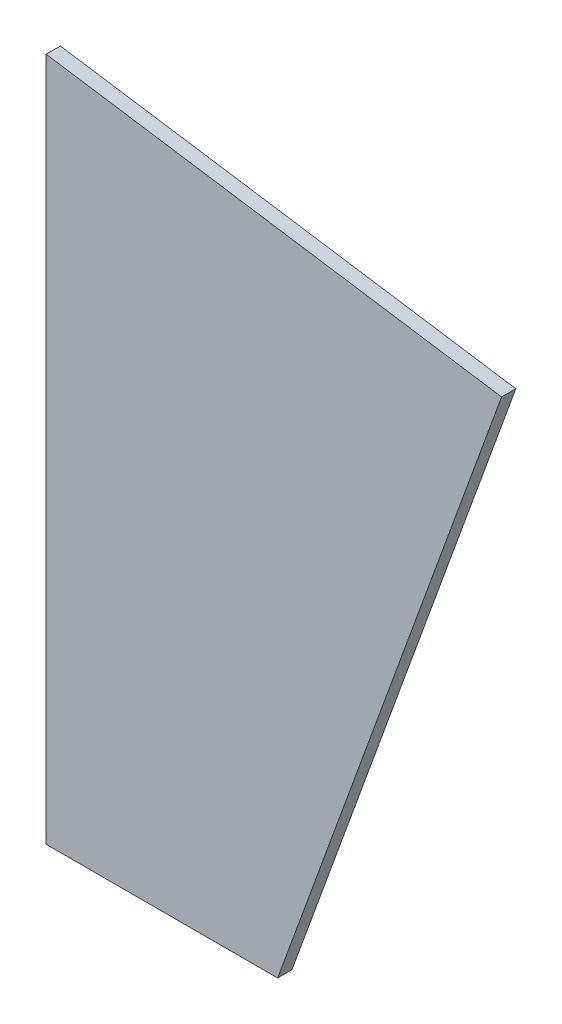
ISO-10303-21;
HEADER;
FILE_DESCRIPTION(('STEP AP214'),'2;1');
FILE_NAME('part.step','',(''),(''),'','','');
FILE_SCHEMA(('AUTOMOTIVE_DESIGN { 1 0 10303 214 1 1 1 1 }'));
ENDSEC;
DATA;
#1=APPLICATION_CONTEXT('core data for automotive mechanical design processes');
#2=APPLICATION_PROTOCOL_DEFINITION('international standard','automotive_design',2000,#1);
#3=PRODUCT_CONTEXT('',#1,'mechanical');
#4=PRODUCT('Part','Part','',(#3));
#5=PRODUCT_RELATED_PRODUCT_CATEGORY('part','',(#4));
#6=PRODUCT_DEFINITION_FORMATION('','',#4);
#7=PRODUCT_DEFINITION_CONTEXT('part definition',#1,'design');
#8=PRODUCT_DEFINITION('design','',#6,#7);
#9=PRODUCT_DEFINITION_SHAPE('','',#8);
#10=(LENGTH_UNIT() NAMED_UNIT(*) SI_UNIT(.MILLI.,.METRE.));
#11=(NAMED_UNIT(*) PLANE_ANGLE_UNIT() SI_UNIT($,.RADIAN.));
#12=(NAMED_UNIT(*) SI_UNIT($,.STERADIAN.) SOLID_ANGLE_UNIT());
#13=UNCERTAINTY_MEASURE_WITH_UNIT(LENGTH_MEASURE(1.E-05),#10,'distance_accuracy_value','');
#14=(GEOMETRIC_REPRESENTATION_CONTEXT(3) GLOBAL_UNCERTAINTY_ASSIGNED_CONTEXT((#13)) GLOBAL_UNIT_ASSIGNED_CONTEXT((#10,
#11,#12)) REPRESENTATION_CONTEXT('',''));
#15=CARTESIAN_POINT('',(0.,0.,0.));
#16=DIRECTION('',(0.,0.,1.));
#17=DIRECTION('',(1.,0.,0.));
#18=AXIS2_PLACEMENT_3D('',#15,#16,#17);
#19=CARTESIAN_POINT('',(0.,0.,3.175));
#20=DIRECTION('',(0.,1.,0.));
#21=DIRECTION('',(0.,0.,1.));
#22=AXIS2_PLACEMENT_3D('',#19,#20,#21);
#23=PLANE('',#22);
#24=DIRECTION('',(1.,0.,0.));
#25=VECTOR('',#24,1.);
#26=CARTESIAN_POINT('',(0.,0.,0.));
#27=LINE('',#26,#25);
#28=CARTESIAN_POINT('',(0.,0.,0.));
#29=VERTEX_POINT('',#28);
#30=CARTESIAN_POINT('',(51.562,0.,0.));
#31=VERTEX_POINT('',#30);
#32=EDGE_CURVE('E96',#29,#31,#27,.T.);
#33=ORIENTED_EDGE('',*,*,#32,.T.);
#34=DIRECTION('',(0.,0.,-1.));
#35=VECTOR('',#34,1.);
#36=CARTESIAN_POINT('',(51.562,0.,3.175));
#37=LINE('',#36,#35);
#38=CARTESIAN_POINT('',(51.562,0.,3.175));
#39=VERTEX_POINT('',#38);
#40=EDGE_CURVE('E11',#39,#31,#37,.T.);
#41=ORIENTED_EDGE('',*,*,#40,.F.);
#42=DIRECTION('',(1.,0.,0.));
#43=VECTOR('',#42,1.);
#44=CARTESIAN_POINT('',(0.,0.,3.175));
#45=LINE('',#44,#43);
#46=CARTESIAN_POINT('',(0.,0.,3.175));
#47=VERTEX_POINT('',#46);
#48=EDGE_CURVE('E84',#47,#39,#45,.T.);
#49=ORIENTED_EDGE('',*,*,#48,.F.);
#50=DIRECTION('',(0.,0.,-1.));
#51=VECTOR('',#50,1.);
#52=CARTESIAN_POINT('',(0.,0.,3.175));
#53=LINE('',#52,#51);
#54=EDGE_CURVE('E92',#47,#29,#53,.T.);
#55=ORIENTED_EDGE('',*,*,#54,.T.);
#56=EDGE_LOOP('',(#33,#41,#49,#55));
#57=FACE_BOUND('',#56,.T.);
#58=ADVANCED_FACE('F33',(#57),#23,.F.);
#59=CARTESIAN_POINT('',(51.562,0.,3.175));
#60=DIRECTION('',(-0.939692620785909,0.342020143325666,0.));
#61=DIRECTION('',(-0.342020143325666,-0.93969262078591,0.));
#62=AXIS2_PLACEMENT_3D('',#59,#60,#61);
#63=PLANE('',#62);
#64=DIRECTION('',(0.342020143325666,0.93969262078591,0.));
#65=VECTOR('',#64,1.);
#66=CARTESIAN_POINT('',(51.562,0.,0.));
#67=LINE('',#66,#65);
#68=CARTESIAN_POINT('',(101.427168816309,137.003425340102,0.));
#69=VERTEX_POINT('',#68);
#70=EDGE_CURVE('E88',#31,#69,#67,.T.);
#71=ORIENTED_EDGE('',*,*,#70,.T.);
#72=DIRECTION('',(0.,0.,-1.));
#73=VECTOR('',#72,1.);
#74=CARTESIAN_POINT('',(101.427168816309,137.003425340102,3.175));
#75=LINE('',#74,#73);
#76=CARTESIAN_POINT('',(101.427168816309,137.003425340102,3.175));
#77=VERTEX_POINT('',#76);
#78=EDGE_CURVE('E41',#77,#69,#75,.T.);
#79=ORIENTED_EDGE('',*,*,#78,.F.);
#80=DIRECTION('',(0.342020143325666,0.93969262078591,0.));
#81=VECTOR('',#80,1.);
#82=CARTESIAN_POINT('',(51.562,0.,3.175));
#83=LINE('',#82,#81);
#84=EDGE_CURVE('E79',#39,#77,#83,.T.);
#85=ORIENTED_EDGE('',*,*,#84,.F.);
#86=ORIENTED_EDGE('',*,*,#40,.T.);
#87=EDGE_LOOP('',(#71,#79,#85,#86));
#88=FACE_BOUND('',#87,.T.);
#89=ADVANCED_FACE('F87',(#88),#63,.F.);
#90=CARTESIAN_POINT('',(101.427168816309,137.003425340102,3.175));
#91=DIRECTION('',(-0.150080012940133,-0.988673854067098,0.));
#92=DIRECTION('',(0.988673854067098,-0.150080012940133,0.));
#93=AXIS2_PLACEMENT_3D('',#90,#91,#92);
#94=PLANE('',#93);
#95=DIRECTION('',(-0.988673854067098,0.150080012940133,0.));
#96=VECTOR('',#95,1.);
#97=CARTESIAN_POINT('',(101.427168816309,137.003425340102,0.));
#98=LINE('',#97,#96);
#99=CARTESIAN_POINT('',(0.,152.4,0.));
#100=VERTEX_POINT('',#99);
#101=EDGE_CURVE('E66',#69,#100,#98,.T.);
#102=ORIENTED_EDGE('',*,*,#101,.T.);
#103=DIRECTION('',(0.,0.,-1.));
#104=VECTOR('',#103,1.);
#105=CARTESIAN_POINT('',(0.,152.4,3.175));
#106=LINE('',#105,#104);
#107=CARTESIAN_POINT('',(0.,152.4,3.175));
#108=VERTEX_POINT('',#107);
#109=EDGE_CURVE('E89',#108,#100,#106,.T.);
#110=ORIENTED_EDGE('',*,*,#109,.F.);
#111=DIRECTION('',(-0.988673854067098,0.150080012940133,0.));
#112=VECTOR('',#111,1.);
#113=CARTESIAN_POINT('',(101.427168816309,137.003425340102,3.175));
#114=LINE('',#113,#112);
#115=EDGE_CURVE('E82',#77,#108,#114,.T.);
#116=ORIENTED_EDGE('',*,*,#115,.F.);
#117=ORIENTED_EDGE('',*,*,#78,.T.);
#118=EDGE_LOOP('',(#102,#110,#116,#117));
#119=FACE_BOUND('',#118,.T.);
#120=ADVANCED_FACE('F90',(#119),#94,.F.);
#121=CARTESIAN_POINT('',(0.,0.,3.175));
#122=DIRECTION('',(1.,0.,0.));
#123=DIRECTION('',(0.,0.,-1.));
#124=AXIS2_PLACEMENT_3D('',#121,#122,#123);
#125=PLANE('',#124);
#126=DIRECTION('',(0.,-1.,0.));
#127=VECTOR('',#126,1.);
#128=CARTESIAN_POINT('',(0.,0.,0.));
#129=LINE('',#128,#127);
#130=EDGE_CURVE('E72',#100,#29,#129,.T.);
#131=ORIENTED_EDGE('',*,*,#130,.T.);
#132=ORIENTED_EDGE('',*,*,#54,.F.);
#133=DIRECTION('',(0.,-1.,0.));
#134=VECTOR('',#133,1.);
#135=CARTESIAN_POINT('',(0.,0.,3.175));
#136=LINE('',#135,#134);
#137=EDGE_CURVE('E49',#108,#47,#136,.T.);
#138=ORIENTED_EDGE('',*,*,#137,.F.);
#139=ORIENTED_EDGE('',*,*,#109,.T.);
#140=EDGE_LOOP('',(#131,#132,#138,#139));
#141=FACE_BOUND('',#140,.T.);
#142=ADVANCED_FACE('F103',(#141),#125,.F.);
#143=CARTESIAN_POINT('',(0.,0.,3.175));
#144=DIRECTION('',(0.,0.,1.));
#145=DIRECTION('',(1.,0.,0.));
#146=AXIS2_PLACEMENT_3D('',#143,#144,#145);
#147=PLANE('',#146);
#148=ORIENTED_EDGE('',*,*,#48,.T.);
#149=ORIENTED_EDGE('',*,*,#84,.T.);
#150=ORIENTED_EDGE('',*,*,#115,.T.);
#151=ORIENTED_EDGE('',*,*,#137,.T.);
#152=EDGE_LOOP('',(#148,#149,#150,#151));
#153=FACE_BOUND('',#152,.T.);
#154=ADVANCED_FACE('F80',(#153),#147,.T.);
#155=CARTESIAN_POINT('',(0.,0.,0.));
#156=DIRECTION('',(0.,0.,1.));
#157=DIRECTION('',(1.,0.,0.));
#158=AXIS2_PLACEMENT_3D('',#155,#156,#157);
#159=PLANE('',#158);
#160=ORIENTED_EDGE('',*,*,#32,.F.);
#161=ORIENTED_EDGE('',*,*,#130,.F.);
#162=ORIENTED_EDGE('',*,*,#101,.F.);
#163=ORIENTED_EDGE('',*,*,#70,.F.);
#164=EDGE_LOOP('',(#160,#161,#162,#163));
#165=FACE_BOUND('',#164,.T.);
#166=ADVANCED_FACE('F106',(#165),#159,.F.);
#167=CLOSED_SHELL('',(#58,#89,#120,#142,#154,#166));
#168=MANIFOLD_SOLID_BREP('B2',#167);
#169=ADVANCED_BREP_SHAPE_REPRESENTATION('',(#18,#168),#14);
#170=SHAPE_DEFINITION_REPRESENTATION(#9,#169);
ENDSEC;
END-ISO-10303-21;
